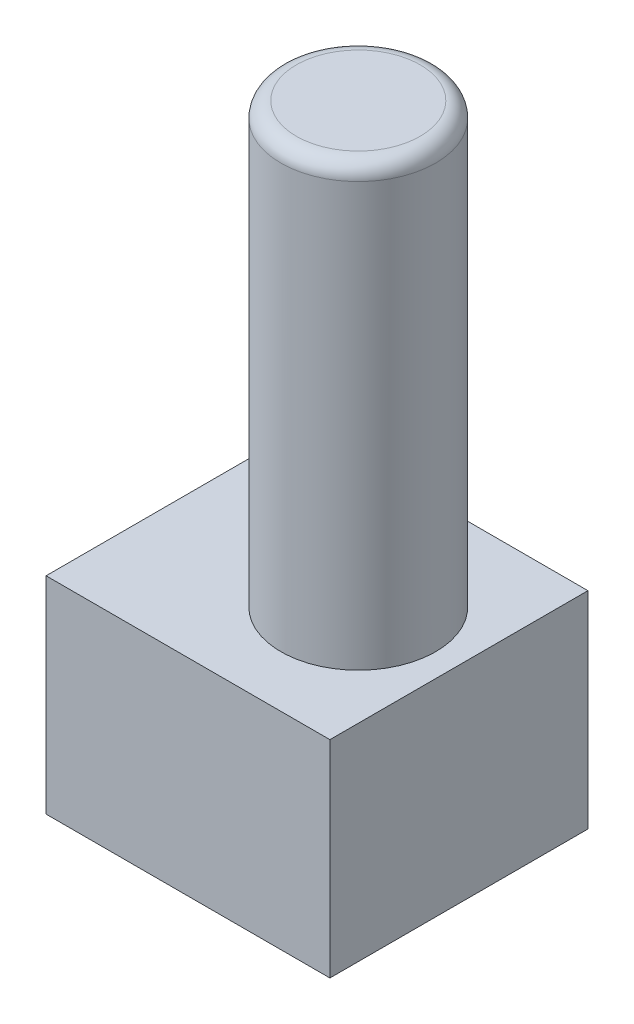
ISO-10303-21;
HEADER;
FILE_DESCRIPTION(('STEP AP214'),'2;1');
FILE_NAME('part.step','',(''),(''),'','','');
FILE_SCHEMA(('AUTOMOTIVE_DESIGN { 1 0 10303 214 1 1 1 1 }'));
ENDSEC;
DATA;
#1=APPLICATION_CONTEXT('core data for automotive mechanical design processes');
#2=APPLICATION_PROTOCOL_DEFINITION('international standard','automotive_design',2000,#1);
#3=PRODUCT_CONTEXT('',#1,'mechanical');
#4=PRODUCT('Part','Part','',(#3));
#5=PRODUCT_RELATED_PRODUCT_CATEGORY('part','',(#4));
#6=PRODUCT_DEFINITION_FORMATION('','',#4);
#7=PRODUCT_DEFINITION_CONTEXT('part definition',#1,'design');
#8=PRODUCT_DEFINITION('design','',#6,#7);
#9=PRODUCT_DEFINITION_SHAPE('','',#8);
#10=(LENGTH_UNIT() NAMED_UNIT(*) SI_UNIT(.MILLI.,.METRE.));
#11=(NAMED_UNIT(*) PLANE_ANGLE_UNIT() SI_UNIT($,.RADIAN.));
#12=(NAMED_UNIT(*) SI_UNIT($,.STERADIAN.) SOLID_ANGLE_UNIT());
#13=UNCERTAINTY_MEASURE_WITH_UNIT(LENGTH_MEASURE(1.E-05),#10,'distance_accuracy_value','');
#14=(GEOMETRIC_REPRESENTATION_CONTEXT(3) GLOBAL_UNCERTAINTY_ASSIGNED_CONTEXT((#13)) GLOBAL_UNIT_ASSIGNED_CONTEXT((#10,
#11,#12)) REPRESENTATION_CONTEXT('',''));
#15=CARTESIAN_POINT('',(0.,0.,0.));
#16=DIRECTION('',(0.,0.,1.));
#17=DIRECTION('',(1.,0.,0.));
#18=AXIS2_PLACEMENT_3D('',#15,#16,#17);
#19=CARTESIAN_POINT('',(1.6,25.,0.));
#20=DIRECTION('',(0.,-1.,0.));
#21=DIRECTION('',(0.,0.,-1.));
#22=AXIS2_PLACEMENT_3D('',#19,#20,#21);
#23=CYLINDRICAL_SURFACE('',#22,3.);
#24=CARTESIAN_POINT('',(1.6,24.4,0.));
#25=DIRECTION('',(0.,1.,0.));
#26=DIRECTION('',(0.,0.,1.));
#27=AXIS2_PLACEMENT_3D('',#24,#25,#26);
#28=CIRCLE('',#27,3.);
#29=CARTESIAN_POINT('',(1.6,24.4,3.));
#30=VERTEX_POINT('',#29);
#31=EDGE_CURVE('E11',#30,#30,#28,.F.);
#32=ORIENTED_EDGE('',*,*,#31,.T.);
#33=EDGE_LOOP('',(#32));
#34=FACE_BOUND('',#33,.T.);
#35=CARTESIAN_POINT('',(1.6,8.,0.));
#36=DIRECTION('',(0.,-1.,0.));
#37=DIRECTION('',(0.,0.,-1.));
#38=AXIS2_PLACEMENT_3D('',#35,#36,#37);
#39=CIRCLE('',#38,3.);
#40=CARTESIAN_POINT('',(1.6,8.,-3.));
#41=VERTEX_POINT('',#40);
#42=EDGE_CURVE('E115',#41,#41,#39,.T.);
#43=ORIENTED_EDGE('',*,*,#42,.F.);
#44=EDGE_LOOP('',(#43));
#45=FACE_BOUND('',#44,.T.);
#46=ADVANCED_FACE('F37',(#34,#45),#23,.T.);
#47=CARTESIAN_POINT('',(0.,25.,0.));
#48=DIRECTION('',(0.,1.,0.));
#49=DIRECTION('',(0.,0.,1.));
#50=AXIS2_PLACEMENT_3D('',#47,#48,#49);
#51=PLANE('',#50);
#52=CARTESIAN_POINT('',(1.6,25.,0.));
#53=DIRECTION('',(0.,1.,0.));
#54=DIRECTION('',(0.,0.,1.));
#55=AXIS2_PLACEMENT_3D('',#52,#53,#54);
#56=CIRCLE('',#55,2.4);
#57=CARTESIAN_POINT('',(1.6,25.,2.4));
#58=VERTEX_POINT('',#57);
#59=EDGE_CURVE('E46',#58,#58,#56,.T.);
#60=ORIENTED_EDGE('',*,*,#59,.T.);
#61=EDGE_LOOP('',(#60));
#62=FACE_BOUND('',#61,.T.);
#63=ADVANCED_FACE('F120',(#62),#51,.T.);
#64=CARTESIAN_POINT('',(0.,8.,0.));
#65=DIRECTION('',(0.,-1.,0.));
#66=DIRECTION('',(0.,0.,-1.));
#67=AXIS2_PLACEMENT_3D('',#64,#65,#66);
#68=PLANE('',#67);
#69=DIRECTION('',(0.,0.,-1.));
#70=VECTOR('',#69,1.);
#71=CARTESIAN_POINT('',(5.5,8.,5.));
#72=LINE('',#71,#70);
#73=CARTESIAN_POINT('',(5.5,8.,5.));
#74=VERTEX_POINT('',#73);
#75=CARTESIAN_POINT('',(5.5,8.,-5.));
#76=VERTEX_POINT('',#75);
#77=EDGE_CURVE('E91',#74,#76,#72,.T.);
#78=ORIENTED_EDGE('',*,*,#77,.T.);
#79=DIRECTION('',(-1.,0.,0.));
#80=VECTOR('',#79,1.);
#81=CARTESIAN_POINT('',(-5.5,8.,-5.));
#82=LINE('',#81,#80);
#83=CARTESIAN_POINT('',(-5.5,8.,-5.));
#84=VERTEX_POINT('',#83);
#85=EDGE_CURVE('E85',#76,#84,#82,.T.);
#86=ORIENTED_EDGE('',*,*,#85,.T.);
#87=DIRECTION('',(0.,0.,1.));
#88=VECTOR('',#87,1.);
#89=CARTESIAN_POINT('',(-5.5,8.,5.));
#90=LINE('',#89,#88);
#91=CARTESIAN_POINT('',(-5.5,8.,5.));
#92=VERTEX_POINT('',#91);
#93=EDGE_CURVE('E89',#84,#92,#90,.T.);
#94=ORIENTED_EDGE('',*,*,#93,.T.);
#95=DIRECTION('',(1.,0.,0.));
#96=VECTOR('',#95,1.);
#97=CARTESIAN_POINT('',(-5.5,8.,5.));
#98=LINE('',#97,#96);
#99=EDGE_CURVE('E54',#92,#74,#98,.T.);
#100=ORIENTED_EDGE('',*,*,#99,.T.);
#101=EDGE_LOOP('',(#78,#86,#94,#100));
#102=FACE_BOUND('',#101,.T.);
#103=ORIENTED_EDGE('',*,*,#42,.T.);
#104=EDGE_LOOP('',(#103));
#105=FACE_BOUND('',#104,.T.);
#106=ADVANCED_FACE('F86',(#102,#105),#68,.F.);
#107=CARTESIAN_POINT('',(5.5,8.,5.));
#108=DIRECTION('',(-1.,0.,0.));
#109=DIRECTION('',(0.,0.,1.));
#110=AXIS2_PLACEMENT_3D('',#107,#108,#109);
#111=PLANE('',#110);
#112=DIRECTION('',(0.,0.,-1.));
#113=VECTOR('',#112,1.);
#114=CARTESIAN_POINT('',(5.5,0.,5.));
#115=LINE('',#114,#113);
#116=CARTESIAN_POINT('',(5.5,0.,5.));
#117=VERTEX_POINT('',#116);
#118=CARTESIAN_POINT('',(5.5,0.,-5.));
#119=VERTEX_POINT('',#118);
#120=EDGE_CURVE('E106',#117,#119,#115,.T.);
#121=ORIENTED_EDGE('',*,*,#120,.T.);
#122=DIRECTION('',(0.,-1.,0.));
#123=VECTOR('',#122,1.);
#124=CARTESIAN_POINT('',(5.5,8.,-5.));
#125=LINE('',#124,#123);
#126=EDGE_CURVE('E97',#76,#119,#125,.T.);
#127=ORIENTED_EDGE('',*,*,#126,.F.);
#128=ORIENTED_EDGE('',*,*,#77,.F.);
#129=DIRECTION('',(0.,-1.,0.));
#130=VECTOR('',#129,1.);
#131=CARTESIAN_POINT('',(5.5,8.,5.));
#132=LINE('',#131,#130);
#133=EDGE_CURVE('E102',#74,#117,#132,.T.);
#134=ORIENTED_EDGE('',*,*,#133,.T.);
#135=EDGE_LOOP('',(#121,#127,#128,#134));
#136=FACE_BOUND('',#135,.T.);
#137=ADVANCED_FACE('F140',(#136),#111,.F.);
#138=CARTESIAN_POINT('',(-5.5,8.,-5.));
#139=DIRECTION('',(0.,0.,1.));
#140=DIRECTION('',(1.,0.,0.));
#141=AXIS2_PLACEMENT_3D('',#138,#139,#140);
#142=PLANE('',#141);
#143=DIRECTION('',(-1.,0.,0.));
#144=VECTOR('',#143,1.);
#145=CARTESIAN_POINT('',(-5.5,0.,-5.));
#146=LINE('',#145,#144);
#147=CARTESIAN_POINT('',(-5.5,0.,-5.));
#148=VERTEX_POINT('',#147);
#149=EDGE_CURVE('E96',#119,#148,#146,.T.);
#150=ORIENTED_EDGE('',*,*,#149,.T.);
#151=DIRECTION('',(0.,-1.,0.));
#152=VECTOR('',#151,1.);
#153=CARTESIAN_POINT('',(-5.5,8.,-5.));
#154=LINE('',#153,#152);
#155=EDGE_CURVE('E94',#84,#148,#154,.T.);
#156=ORIENTED_EDGE('',*,*,#155,.F.);
#157=ORIENTED_EDGE('',*,*,#85,.F.);
#158=ORIENTED_EDGE('',*,*,#126,.T.);
#159=EDGE_LOOP('',(#150,#156,#157,#158));
#160=FACE_BOUND('',#159,.T.);
#161=ADVANCED_FACE('F95',(#160),#142,.F.);
#162=CARTESIAN_POINT('',(-5.5,8.,5.));
#163=DIRECTION('',(1.,0.,0.));
#164=DIRECTION('',(0.,0.,-1.));
#165=AXIS2_PLACEMENT_3D('',#162,#163,#164);
#166=PLANE('',#165);
#167=DIRECTION('',(0.,0.,1.));
#168=VECTOR('',#167,1.);
#169=CARTESIAN_POINT('',(-5.5,0.,5.));
#170=LINE('',#169,#168);
#171=CARTESIAN_POINT('',(-5.5,0.,5.));
#172=VERTEX_POINT('',#171);
#173=EDGE_CURVE('E71',#148,#172,#170,.T.);
#174=ORIENTED_EDGE('',*,*,#173,.T.);
#175=DIRECTION('',(0.,-1.,0.));
#176=VECTOR('',#175,1.);
#177=CARTESIAN_POINT('',(-5.5,8.,5.));
#178=LINE('',#177,#176);
#179=EDGE_CURVE('E98',#92,#172,#178,.T.);
#180=ORIENTED_EDGE('',*,*,#179,.F.);
#181=ORIENTED_EDGE('',*,*,#93,.F.);
#182=ORIENTED_EDGE('',*,*,#155,.T.);
#183=EDGE_LOOP('',(#174,#180,#181,#182));
#184=FACE_BOUND('',#183,.T.);
#185=ADVANCED_FACE('F100',(#184),#166,.F.);
#186=CARTESIAN_POINT('',(-5.5,8.,5.));
#187=DIRECTION('',(0.,0.,-1.));
#188=DIRECTION('',(-1.,0.,0.));
#189=AXIS2_PLACEMENT_3D('',#186,#187,#188);
#190=PLANE('',#189);
#191=DIRECTION('',(1.,0.,0.));
#192=VECTOR('',#191,1.);
#193=CARTESIAN_POINT('',(-5.5,0.,5.));
#194=LINE('',#193,#192);
#195=EDGE_CURVE('E77',#172,#117,#194,.T.);
#196=ORIENTED_EDGE('',*,*,#195,.T.);
#197=ORIENTED_EDGE('',*,*,#133,.F.);
#198=ORIENTED_EDGE('',*,*,#99,.F.);
#199=ORIENTED_EDGE('',*,*,#179,.T.);
#200=EDGE_LOOP('',(#196,#197,#198,#199));
#201=FACE_BOUND('',#200,.T.);
#202=ADVANCED_FACE('F128',(#201),#190,.F.);
#203=CARTESIAN_POINT('',(0.,0.,0.));
#204=DIRECTION('',(0.,1.,0.));
#205=DIRECTION('',(0.,0.,1.));
#206=AXIS2_PLACEMENT_3D('',#203,#204,#205);
#207=PLANE('',#206);
#208=ORIENTED_EDGE('',*,*,#120,.F.);
#209=ORIENTED_EDGE('',*,*,#195,.F.);
#210=ORIENTED_EDGE('',*,*,#173,.F.);
#211=ORIENTED_EDGE('',*,*,#149,.F.);
#212=EDGE_LOOP('',(#208,#209,#210,#211));
#213=FACE_BOUND('',#212,.T.);
#214=ADVANCED_FACE('F123',(#213),#207,.F.);
#215=CARTESIAN_POINT('',(1.6,24.4,0.));
#216=DIRECTION('',(0.,1.,0.));
#217=DIRECTION('',(0.,0.,1.));
#218=AXIS2_PLACEMENT_3D('',#215,#216,#217);
#219=TOROIDAL_SURFACE('',#218,2.4,0.6);
#220=ORIENTED_EDGE('',*,*,#31,.F.);
#221=EDGE_LOOP('',(#220));
#222=FACE_BOUND('',#221,.T.);
#223=ORIENTED_EDGE('',*,*,#59,.F.);
#224=EDGE_LOOP('',(#223));
#225=FACE_BOUND('',#224,.T.);
#226=ADVANCED_FACE('F39',(#222,#225),#219,.T.);
#227=CLOSED_SHELL('',(#46,#63,#106,#137,#161,#185,#202,#214,#226));
#228=MANIFOLD_SOLID_BREP('B2',#227);
#229=ADVANCED_BREP_SHAPE_REPRESENTATION('',(#18,#228),#14);
#230=SHAPE_DEFINITION_REPRESENTATION(#9,#229);
ENDSEC;
END-ISO-10303-21;
